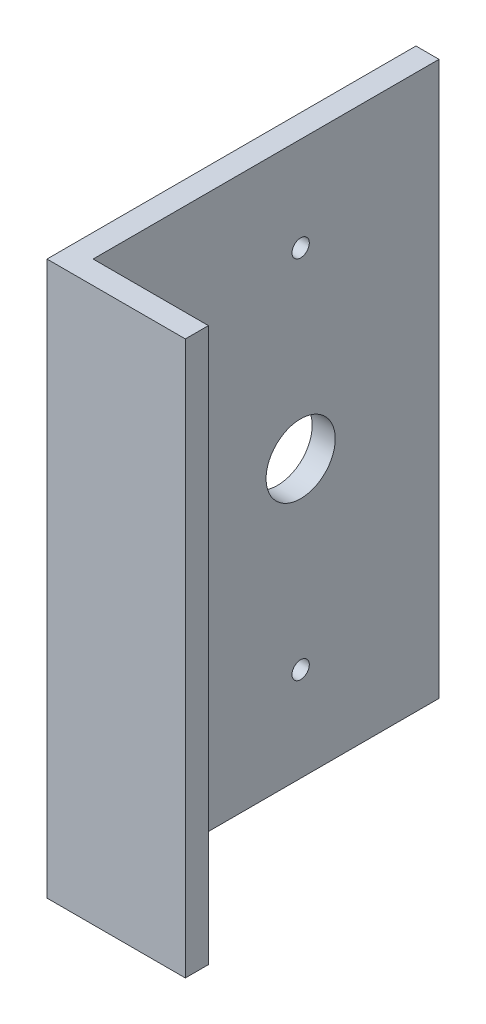
ISO-10303-21;
HEADER;
FILE_DESCRIPTION(('STEP AP214'),'2;1');
FILE_NAME('part.step','',(''),(''),'','','');
FILE_SCHEMA(('AUTOMOTIVE_DESIGN { 1 0 10303 214 1 1 1 1 }'));
ENDSEC;
DATA;
#1=APPLICATION_CONTEXT('core data for automotive mechanical design processes');
#2=APPLICATION_PROTOCOL_DEFINITION('international standard','automotive_design',2000,#1);
#3=PRODUCT_CONTEXT('',#1,'mechanical');
#4=PRODUCT('Part','Part','',(#3));
#5=PRODUCT_RELATED_PRODUCT_CATEGORY('part','',(#4));
#6=PRODUCT_DEFINITION_FORMATION('','',#4);
#7=PRODUCT_DEFINITION_CONTEXT('part definition',#1,'design');
#8=PRODUCT_DEFINITION('design','',#6,#7);
#9=PRODUCT_DEFINITION_SHAPE('','',#8);
#10=(LENGTH_UNIT() NAMED_UNIT(*) SI_UNIT(.MILLI.,.METRE.));
#11=(NAMED_UNIT(*) PLANE_ANGLE_UNIT() SI_UNIT($,.RADIAN.));
#12=(NAMED_UNIT(*) SI_UNIT($,.STERADIAN.) SOLID_ANGLE_UNIT());
#13=UNCERTAINTY_MEASURE_WITH_UNIT(LENGTH_MEASURE(1.E-05),#10,'distance_accuracy_value','');
#14=(GEOMETRIC_REPRESENTATION_CONTEXT(3) GLOBAL_UNCERTAINTY_ASSIGNED_CONTEXT((#13)) GLOBAL_UNIT_ASSIGNED_CONTEXT((#10,
#11,#12)) REPRESENTATION_CONTEXT('',''));
#15=CARTESIAN_POINT('',(0.,0.,0.));
#16=DIRECTION('',(0.,0.,1.));
#17=DIRECTION('',(1.,0.,0.));
#18=AXIS2_PLACEMENT_3D('',#15,#16,#17);
#19=CARTESIAN_POINT('',(0.,76.2,0.));
#20=DIRECTION('',(0.,0.,-1.));
#21=DIRECTION('',(-1.,0.,0.));
#22=AXIS2_PLACEMENT_3D('',#19,#20,#21);
#23=PLANE('',#22);
#24=DIRECTION('',(1.,0.,0.));
#25=VECTOR('',#24,1.);
#26=CARTESIAN_POINT('',(0.,0.,0.));
#27=LINE('',#26,#25);
#28=CARTESIAN_POINT('',(0.,0.,0.));
#29=VERTEX_POINT('',#28);
#30=CARTESIAN_POINT('',(19.05,0.,0.));
#31=VERTEX_POINT('',#30);
#32=EDGE_CURVE('E114',#29,#31,#27,.T.);
#33=ORIENTED_EDGE('',*,*,#32,.T.);
#34=DIRECTION('',(0.,-1.,0.));
#35=VECTOR('',#34,1.);
#36=CARTESIAN_POINT('',(19.05,76.2,0.));
#37=LINE('',#36,#35);
#38=CARTESIAN_POINT('',(19.05,76.2,0.));
#39=VERTEX_POINT('',#38);
#40=EDGE_CURVE('E11',#39,#31,#37,.T.);
#41=ORIENTED_EDGE('',*,*,#40,.F.);
#42=DIRECTION('',(1.,0.,0.));
#43=VECTOR('',#42,1.);
#44=CARTESIAN_POINT('',(0.,76.2,0.));
#45=LINE('',#44,#43);
#46=CARTESIAN_POINT('',(0.,76.2,0.));
#47=VERTEX_POINT('',#46);
#48=EDGE_CURVE('E79',#47,#39,#45,.T.);
#49=ORIENTED_EDGE('',*,*,#48,.F.);
#50=DIRECTION('',(0.,-1.,0.));
#51=VECTOR('',#50,1.);
#52=CARTESIAN_POINT('',(0.,76.2,0.));
#53=LINE('',#52,#51);
#54=EDGE_CURVE('E110',#47,#29,#53,.T.);
#55=ORIENTED_EDGE('',*,*,#54,.T.);
#56=EDGE_LOOP('',(#33,#41,#49,#55));
#57=FACE_BOUND('',#56,.T.);
#58=ADVANCED_FACE('F33',(#57),#23,.F.);
#59=CARTESIAN_POINT('',(19.05,76.2,-3.175));
#60=DIRECTION('',(1.,0.,0.));
#61=DIRECTION('',(0.,0.,-1.));
#62=AXIS2_PLACEMENT_3D('',#59,#60,#61);
#63=PLANE('',#62);
#64=DIRECTION('',(0.,0.,1.));
#65=VECTOR('',#64,1.);
#66=CARTESIAN_POINT('',(19.05,0.,-3.175));
#67=LINE('',#66,#65);
#68=CARTESIAN_POINT('',(19.05,0.,-3.175));
#69=VERTEX_POINT('',#68);
#70=EDGE_CURVE('E117',#69,#31,#67,.T.);
#71=ORIENTED_EDGE('',*,*,#70,.F.);
#72=DIRECTION('',(0.,-1.,0.));
#73=VECTOR('',#72,1.);
#74=CARTESIAN_POINT('',(19.05,76.2,-3.175));
#75=LINE('',#74,#73);
#76=CARTESIAN_POINT('',(19.05,76.2,-3.175));
#77=VERTEX_POINT('',#76);
#78=EDGE_CURVE('E41',#77,#69,#75,.T.);
#79=ORIENTED_EDGE('',*,*,#78,.F.);
#80=DIRECTION('',(0.,0.,1.));
#81=VECTOR('',#80,1.);
#82=CARTESIAN_POINT('',(19.05,76.2,-3.175));
#83=LINE('',#82,#81);
#84=EDGE_CURVE('E188',#77,#39,#83,.T.);
#85=ORIENTED_EDGE('',*,*,#84,.T.);
#86=ORIENTED_EDGE('',*,*,#40,.T.);
#87=EDGE_LOOP('',(#71,#79,#85,#86));
#88=FACE_BOUND('',#87,.T.);
#89=ADVANCED_FACE('F136',(#88),#63,.T.);
#90=CARTESIAN_POINT('',(0.,76.2,-3.175));
#91=DIRECTION('',(0.,0.,-1.));
#92=DIRECTION('',(-1.,0.,0.));
#93=AXIS2_PLACEMENT_3D('',#90,#91,#92);
#94=PLANE('',#93);
#95=DIRECTION('',(1.,0.,0.));
#96=VECTOR('',#95,1.);
#97=CARTESIAN_POINT('',(0.,0.,-3.175));
#98=LINE('',#97,#96);
#99=CARTESIAN_POINT('',(3.175,0.,-3.175));
#100=VERTEX_POINT('',#99);
#101=EDGE_CURVE('E121',#100,#69,#98,.T.);
#102=ORIENTED_EDGE('',*,*,#101,.F.);
#103=DIRECTION('',(0.,-1.,0.));
#104=VECTOR('',#103,1.);
#105=CARTESIAN_POINT('',(3.175,76.2,-3.175));
#106=LINE('',#105,#104);
#107=CARTESIAN_POINT('',(3.175,76.2,-3.175));
#108=VERTEX_POINT('',#107);
#109=EDGE_CURVE('E100',#108,#100,#106,.T.);
#110=ORIENTED_EDGE('',*,*,#109,.F.);
#111=DIRECTION('',(1.,0.,0.));
#112=VECTOR('',#111,1.);
#113=CARTESIAN_POINT('',(0.,76.2,-3.175));
#114=LINE('',#113,#112);
#115=EDGE_CURVE('E106',#108,#77,#114,.T.);
#116=ORIENTED_EDGE('',*,*,#115,.T.);
#117=ORIENTED_EDGE('',*,*,#78,.T.);
#118=EDGE_LOOP('',(#102,#110,#116,#117));
#119=FACE_BOUND('',#118,.T.);
#120=ADVANCED_FACE('F133',(#119),#94,.T.);
#121=CARTESIAN_POINT('',(3.175,76.2,0.));
#122=DIRECTION('',(1.,0.,0.));
#123=DIRECTION('',(0.,0.,-1.));
#124=AXIS2_PLACEMENT_3D('',#121,#122,#123);
#125=PLANE('',#124);
#126=CARTESIAN_POINT('',(3.175,38.1,-31.75));
#127=DIRECTION('',(1.,0.,0.));
#128=DIRECTION('',(0.,0.,-1.));
#129=AXIS2_PLACEMENT_3D('',#126,#127,#128);
#130=CIRCLE('',#129,4.7625);
#131=CARTESIAN_POINT('',(3.175,38.1,-36.5125));
#132=VERTEX_POINT('',#131);
#133=EDGE_CURVE('E170',#132,#132,#130,.T.);
#134=ORIENTED_EDGE('',*,*,#133,.F.);
#135=EDGE_LOOP('',(#134));
#136=FACE_BOUND('',#135,.T.);
#137=CARTESIAN_POINT('',(3.175,12.954,-31.75));
#138=DIRECTION('',(1.,0.,0.));
#139=DIRECTION('',(0.,0.,-1.));
#140=AXIS2_PLACEMENT_3D('',#137,#138,#139);
#141=CIRCLE('',#140,1.190625);
#142=CARTESIAN_POINT('',(3.175,12.954,-32.940625));
#143=VERTEX_POINT('',#142);
#144=EDGE_CURVE('E174',#143,#143,#141,.T.);
#145=ORIENTED_EDGE('',*,*,#144,.F.);
#146=EDGE_LOOP('',(#145));
#147=FACE_BOUND('',#146,.T.);
#148=CARTESIAN_POINT('',(3.175,63.246,-31.75));
#149=DIRECTION('',(1.,0.,0.));
#150=DIRECTION('',(0.,0.,-1.));
#151=AXIS2_PLACEMENT_3D('',#148,#149,#150);
#152=CIRCLE('',#151,1.190625);
#153=CARTESIAN_POINT('',(3.175,63.246,-32.940625));
#154=VERTEX_POINT('',#153);
#155=EDGE_CURVE('E177',#154,#154,#152,.T.);
#156=ORIENTED_EDGE('',*,*,#155,.F.);
#157=EDGE_LOOP('',(#156));
#158=FACE_BOUND('',#157,.T.);
#159=DIRECTION('',(0.,0.,-1.));
#160=VECTOR('',#159,1.);
#161=CARTESIAN_POINT('',(3.175,0.,0.));
#162=LINE('',#161,#160);
#163=CARTESIAN_POINT('',(3.175,0.,-50.8));
#164=VERTEX_POINT('',#163);
#165=EDGE_CURVE('E95',#164,#100,#162,.F.);
#166=ORIENTED_EDGE('',*,*,#165,.F.);
#167=DIRECTION('',(0.,-1.,0.));
#168=VECTOR('',#167,1.);
#169=CARTESIAN_POINT('',(3.175,76.2,-50.8));
#170=LINE('',#169,#168);
#171=CARTESIAN_POINT('',(3.175,76.2,-50.8));
#172=VERTEX_POINT('',#171);
#173=EDGE_CURVE('E90',#172,#164,#170,.T.);
#174=ORIENTED_EDGE('',*,*,#173,.F.);
#175=DIRECTION('',(0.,0.,-1.));
#176=VECTOR('',#175,1.);
#177=CARTESIAN_POINT('',(3.175,76.2,0.));
#178=LINE('',#177,#176);
#179=EDGE_CURVE('E93',#172,#108,#178,.F.);
#180=ORIENTED_EDGE('',*,*,#179,.T.);
#181=ORIENTED_EDGE('',*,*,#109,.T.);
#182=EDGE_LOOP('',(#166,#174,#180,#181));
#183=FACE_BOUND('',#182,.T.);
#184=ADVANCED_FACE('F92',(#136,#147,#158,#183),#125,.T.);
#185=CARTESIAN_POINT('',(0.,76.2,-50.8));
#186=DIRECTION('',(0.,0.,-1.));
#187=DIRECTION('',(-1.,0.,0.));
#188=AXIS2_PLACEMENT_3D('',#185,#186,#187);
#189=PLANE('',#188);
#190=DIRECTION('',(1.,0.,0.));
#191=VECTOR('',#190,1.);
#192=CARTESIAN_POINT('',(0.,0.,-50.8));
#193=LINE('',#192,#191);
#194=CARTESIAN_POINT('',(0.,0.,-50.8));
#195=VERTEX_POINT('',#194);
#196=EDGE_CURVE('E125',#195,#164,#193,.T.);
#197=ORIENTED_EDGE('',*,*,#196,.F.);
#198=DIRECTION('',(0.,-1.,0.));
#199=VECTOR('',#198,1.);
#200=CARTESIAN_POINT('',(0.,76.2,-50.8));
#201=LINE('',#200,#199);
#202=CARTESIAN_POINT('',(0.,76.2,-50.8));
#203=VERTEX_POINT('',#202);
#204=EDGE_CURVE('E70',#203,#195,#201,.T.);
#205=ORIENTED_EDGE('',*,*,#204,.F.);
#206=DIRECTION('',(1.,0.,0.));
#207=VECTOR('',#206,1.);
#208=CARTESIAN_POINT('',(0.,76.2,-50.8));
#209=LINE('',#208,#207);
#210=EDGE_CURVE('E104',#203,#172,#209,.T.);
#211=ORIENTED_EDGE('',*,*,#210,.T.);
#212=ORIENTED_EDGE('',*,*,#173,.T.);
#213=EDGE_LOOP('',(#197,#205,#211,#212));
#214=FACE_BOUND('',#213,.T.);
#215=ADVANCED_FACE('F108',(#214),#189,.T.);
#216=CARTESIAN_POINT('',(0.,76.2,0.));
#217=DIRECTION('',(1.,0.,0.));
#218=DIRECTION('',(0.,0.,-1.));
#219=AXIS2_PLACEMENT_3D('',#216,#217,#218);
#220=PLANE('',#219);
#221=CARTESIAN_POINT('',(0.,38.1,-31.75));
#222=DIRECTION('',(1.,0.,0.));
#223=DIRECTION('',(0.,0.,-1.));
#224=AXIS2_PLACEMENT_3D('',#221,#222,#223);
#225=CIRCLE('',#224,4.7625);
#226=CARTESIAN_POINT('',(0.,38.1,-36.5125));
#227=VERTEX_POINT('',#226);
#228=EDGE_CURVE('E189',#227,#227,#225,.T.);
#229=ORIENTED_EDGE('',*,*,#228,.T.);
#230=EDGE_LOOP('',(#229));
#231=FACE_BOUND('',#230,.T.);
#232=CARTESIAN_POINT('',(0.,12.954,-31.75));
#233=DIRECTION('',(1.,0.,0.));
#234=DIRECTION('',(0.,0.,-1.));
#235=AXIS2_PLACEMENT_3D('',#232,#233,#234);
#236=CIRCLE('',#235,1.190625);
#237=CARTESIAN_POINT('',(0.,12.954,-32.940625));
#238=VERTEX_POINT('',#237);
#239=EDGE_CURVE('E179',#238,#238,#236,.T.);
#240=ORIENTED_EDGE('',*,*,#239,.T.);
#241=EDGE_LOOP('',(#240));
#242=FACE_BOUND('',#241,.T.);
#243=CARTESIAN_POINT('',(0.,63.246,-31.75));
#244=DIRECTION('',(1.,0.,0.));
#245=DIRECTION('',(0.,0.,-1.));
#246=AXIS2_PLACEMENT_3D('',#243,#244,#245);
#247=CIRCLE('',#246,1.190625);
#248=CARTESIAN_POINT('',(0.,63.246,-32.940625));
#249=VERTEX_POINT('',#248);
#250=EDGE_CURVE('E118',#249,#249,#247,.T.);
#251=ORIENTED_EDGE('',*,*,#250,.T.);
#252=EDGE_LOOP('',(#251));
#253=FACE_BOUND('',#252,.T.);
#254=DIRECTION('',(0.,0.,1.));
#255=VECTOR('',#254,1.);
#256=CARTESIAN_POINT('',(0.,0.,0.));
#257=LINE('',#256,#255);
#258=EDGE_CURVE('E73',#195,#29,#257,.T.);
#259=ORIENTED_EDGE('',*,*,#258,.T.);
#260=ORIENTED_EDGE('',*,*,#54,.F.);
#261=DIRECTION('',(0.,0.,1.));
#262=VECTOR('',#261,1.);
#263=CARTESIAN_POINT('',(0.,76.2,0.));
#264=LINE('',#263,#262);
#265=EDGE_CURVE('E49',#203,#47,#264,.T.);
#266=ORIENTED_EDGE('',*,*,#265,.F.);
#267=ORIENTED_EDGE('',*,*,#204,.T.);
#268=EDGE_LOOP('',(#259,#260,#266,#267));
#269=FACE_BOUND('',#268,.T.);
#270=ADVANCED_FACE('F141',(#231,#242,#253,#269),#220,.F.);
#271=CARTESIAN_POINT('',(0.,76.2,0.));
#272=DIRECTION('',(0.,-1.,0.));
#273=DIRECTION('',(-1.,0.,0.));
#274=AXIS2_PLACEMENT_3D('',#271,#272,#273);
#275=PLANE('',#274);
#276=ORIENTED_EDGE('',*,*,#48,.T.);
#277=ORIENTED_EDGE('',*,*,#84,.F.);
#278=ORIENTED_EDGE('',*,*,#115,.F.);
#279=ORIENTED_EDGE('',*,*,#179,.F.);
#280=ORIENTED_EDGE('',*,*,#210,.F.);
#281=ORIENTED_EDGE('',*,*,#265,.T.);
#282=EDGE_LOOP('',(#276,#277,#278,#279,#280,#281));
#283=FACE_BOUND('',#282,.T.);
#284=ADVANCED_FACE('F103',(#283),#275,.F.);
#285=CARTESIAN_POINT('',(0.,0.,0.));
#286=DIRECTION('',(0.,-1.,0.));
#287=DIRECTION('',(-1.,0.,0.));
#288=AXIS2_PLACEMENT_3D('',#285,#286,#287);
#289=PLANE('',#288);
#290=ORIENTED_EDGE('',*,*,#32,.F.);
#291=ORIENTED_EDGE('',*,*,#258,.F.);
#292=ORIENTED_EDGE('',*,*,#196,.T.);
#293=ORIENTED_EDGE('',*,*,#165,.T.);
#294=ORIENTED_EDGE('',*,*,#101,.T.);
#295=ORIENTED_EDGE('',*,*,#70,.T.);
#296=EDGE_LOOP('',(#290,#291,#292,#293,#294,#295));
#297=FACE_BOUND('',#296,.T.);
#298=ADVANCED_FACE('F139',(#297),#289,.T.);
#299=CARTESIAN_POINT('',(0.,63.246,-31.75));
#300=DIRECTION('',(1.,0.,0.));
#301=DIRECTION('',(0.,0.,-1.));
#302=AXIS2_PLACEMENT_3D('',#299,#300,#301);
#303=CYLINDRICAL_SURFACE('',#302,1.190625);
#304=ORIENTED_EDGE('',*,*,#250,.F.);
#305=EDGE_LOOP('',(#304));
#306=FACE_BOUND('',#305,.T.);
#307=ORIENTED_EDGE('',*,*,#155,.T.);
#308=EDGE_LOOP('',(#307));
#309=FACE_BOUND('',#308,.T.);
#310=ADVANCED_FACE('F202',(#306,#309),#303,.F.);
#311=CARTESIAN_POINT('',(0.,12.954,-31.75));
#312=DIRECTION('',(1.,0.,0.));
#313=DIRECTION('',(0.,0.,-1.));
#314=AXIS2_PLACEMENT_3D('',#311,#312,#313);
#315=CYLINDRICAL_SURFACE('',#314,1.190625);
#316=ORIENTED_EDGE('',*,*,#239,.F.);
#317=EDGE_LOOP('',(#316));
#318=FACE_BOUND('',#317,.T.);
#319=ORIENTED_EDGE('',*,*,#144,.T.);
#320=EDGE_LOOP('',(#319));
#321=FACE_BOUND('',#320,.T.);
#322=ADVANCED_FACE('F197',(#318,#321),#315,.F.);
#323=CARTESIAN_POINT('',(0.,38.1,-31.75));
#324=DIRECTION('',(1.,0.,0.));
#325=DIRECTION('',(0.,0.,-1.));
#326=AXIS2_PLACEMENT_3D('',#323,#324,#325);
#327=CYLINDRICAL_SURFACE('',#326,4.7625);
#328=ORIENTED_EDGE('',*,*,#228,.F.);
#329=EDGE_LOOP('',(#328));
#330=FACE_BOUND('',#329,.T.);
#331=ORIENTED_EDGE('',*,*,#133,.T.);
#332=EDGE_LOOP('',(#331));
#333=FACE_BOUND('',#332,.T.);
#334=ADVANCED_FACE('F194',(#330,#333),#327,.F.);
#335=CLOSED_SHELL('',(#58,#89,#120,#184,#215,#270,#284,#298,#310,#322,#334));
#336=MANIFOLD_SOLID_BREP('B2',#335);
#337=ADVANCED_BREP_SHAPE_REPRESENTATION('',(#18,#336),#14);
#338=SHAPE_DEFINITION_REPRESENTATION(#9,#337);
ENDSEC;
END-ISO-10303-21;
